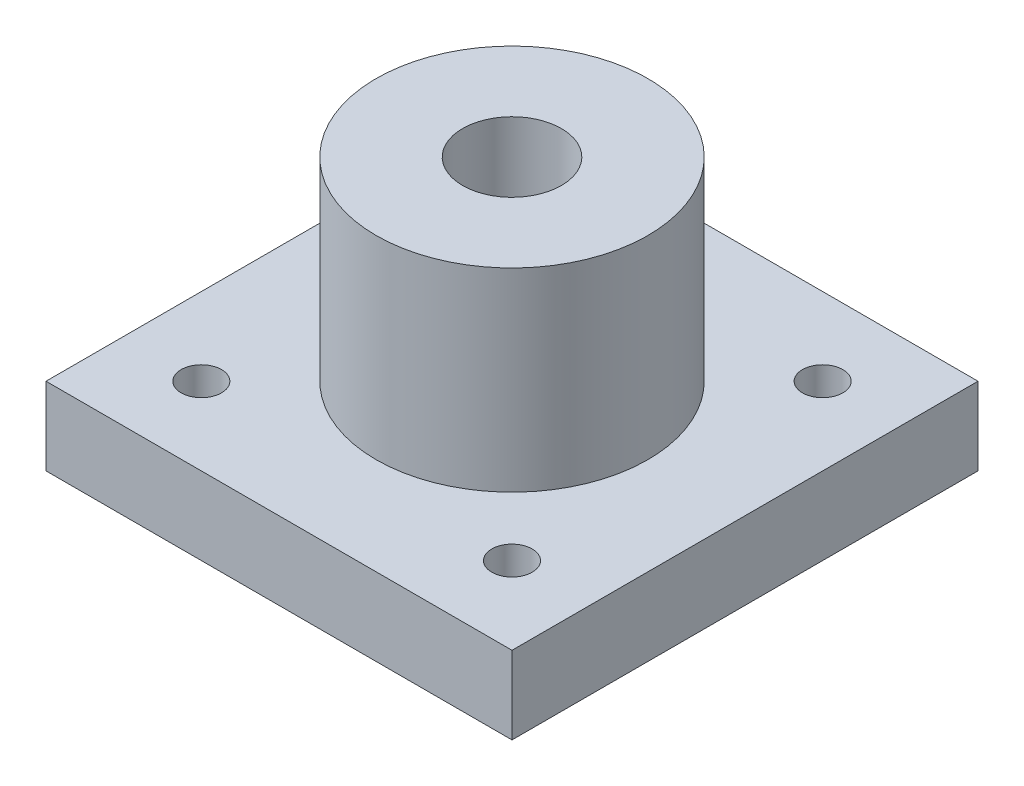
ISO-10303-21;
HEADER;
FILE_DESCRIPTION(('STEP AP214'),'2;1');
FILE_NAME('part.step','',(''),(''),'','','');
FILE_SCHEMA(('AUTOMOTIVE_DESIGN { 1 0 10303 214 1 1 1 1 }'));
ENDSEC;
DATA;
#1=APPLICATION_CONTEXT('core data for automotive mechanical design processes');
#2=APPLICATION_PROTOCOL_DEFINITION('international standard','automotive_design',2000,#1);
#3=PRODUCT_CONTEXT('',#1,'mechanical');
#4=PRODUCT('Part','Part','',(#3));
#5=PRODUCT_RELATED_PRODUCT_CATEGORY('part','',(#4));
#6=PRODUCT_DEFINITION_FORMATION('','',#4);
#7=PRODUCT_DEFINITION_CONTEXT('part definition',#1,'design');
#8=PRODUCT_DEFINITION('design','',#6,#7);
#9=PRODUCT_DEFINITION_SHAPE('','',#8);
#10=(LENGTH_UNIT() NAMED_UNIT(*) SI_UNIT(.MILLI.,.METRE.));
#11=(NAMED_UNIT(*) PLANE_ANGLE_UNIT() SI_UNIT($,.RADIAN.));
#12=(NAMED_UNIT(*) SI_UNIT($,.STERADIAN.) SOLID_ANGLE_UNIT());
#13=UNCERTAINTY_MEASURE_WITH_UNIT(LENGTH_MEASURE(1.E-05),#10,'distance_accuracy_value','');
#14=(GEOMETRIC_REPRESENTATION_CONTEXT(3) GLOBAL_UNCERTAINTY_ASSIGNED_CONTEXT((#13)) GLOBAL_UNIT_ASSIGNED_CONTEXT((#10,
#11,#12)) REPRESENTATION_CONTEXT('',''));
#15=CARTESIAN_POINT('',(0.,0.,0.));
#16=DIRECTION('',(0.,0.,1.));
#17=DIRECTION('',(1.,0.,0.));
#18=AXIS2_PLACEMENT_3D('',#15,#16,#17);
#19=CARTESIAN_POINT('',(0.,10.,0.));
#20=DIRECTION('',(0.,-1.,0.));
#21=DIRECTION('',(0.,0.,-1.));
#22=AXIS2_PLACEMENT_3D('',#19,#20,#21);
#23=PLANE('',#22);
#24=CARTESIAN_POINT('',(0.,10.,0.));
#25=DIRECTION('',(0.,1.,0.));
#26=DIRECTION('',(0.,0.,1.));
#27=AXIS2_PLACEMENT_3D('',#24,#25,#26);
#28=CIRCLE('',#27,17.5);
#29=CARTESIAN_POINT('',(0.,10.,17.5));
#30=VERTEX_POINT('',#29);
#31=EDGE_CURVE('E11',#30,#30,#28,.T.);
#32=ORIENTED_EDGE('',*,*,#31,.F.);
#33=EDGE_LOOP('',(#32));
#34=FACE_BOUND('',#33,.T.);
#35=DIRECTION('',(0.,0.,-1.));
#36=VECTOR('',#35,1.);
#37=CARTESIAN_POINT('',(30.,10.,30.));
#38=LINE('',#37,#36);
#39=CARTESIAN_POINT('',(30.,10.,30.));
#40=VERTEX_POINT('',#39);
#41=CARTESIAN_POINT('',(30.,10.,-30.));
#42=VERTEX_POINT('',#41);
#43=EDGE_CURVE('E95',#40,#42,#38,.T.);
#44=ORIENTED_EDGE('',*,*,#43,.T.);
#45=DIRECTION('',(-1.,0.,0.));
#46=VECTOR('',#45,1.);
#47=CARTESIAN_POINT('',(-30.,10.,-30.));
#48=LINE('',#47,#46);
#49=CARTESIAN_POINT('',(-30.,10.,-30.));
#50=VERTEX_POINT('',#49);
#51=EDGE_CURVE('E87',#42,#50,#48,.T.);
#52=ORIENTED_EDGE('',*,*,#51,.T.);
#53=DIRECTION('',(0.,0.,1.));
#54=VECTOR('',#53,1.);
#55=CARTESIAN_POINT('',(-30.,10.,30.));
#56=LINE('',#55,#54);
#57=CARTESIAN_POINT('',(-30.,10.,30.));
#58=VERTEX_POINT('',#57);
#59=EDGE_CURVE('E89',#50,#58,#56,.T.);
#60=ORIENTED_EDGE('',*,*,#59,.T.);
#61=DIRECTION('',(1.,0.,0.));
#62=VECTOR('',#61,1.);
#63=CARTESIAN_POINT('',(-30.,10.,30.));
#64=LINE('',#63,#62);
#65=EDGE_CURVE('E57',#58,#40,#64,.T.);
#66=ORIENTED_EDGE('',*,*,#65,.T.);
#67=EDGE_LOOP('',(#44,#52,#60,#66));
#68=FACE_BOUND('',#67,.T.);
#69=CARTESIAN_POINT('',(-20.,10.,-20.));
#70=DIRECTION('',(0.,1.,0.));
#71=DIRECTION('',(0.,0.,1.));
#72=AXIS2_PLACEMENT_3D('',#69,#70,#71);
#73=CIRCLE('',#72,2.6);
#74=CARTESIAN_POINT('',(-20.,10.,-17.4));
#75=VERTEX_POINT('',#74);
#76=EDGE_CURVE('E107',#75,#75,#73,.T.);
#77=ORIENTED_EDGE('',*,*,#76,.F.);
#78=EDGE_LOOP('',(#77));
#79=FACE_BOUND('',#78,.T.);
#80=CARTESIAN_POINT('',(20.,10.,-20.));
#81=DIRECTION('',(0.,1.,0.));
#82=DIRECTION('',(0.,0.,1.));
#83=AXIS2_PLACEMENT_3D('',#80,#81,#82);
#84=CIRCLE('',#83,2.6);
#85=CARTESIAN_POINT('',(20.,10.,-17.4));
#86=VERTEX_POINT('',#85);
#87=EDGE_CURVE('E121',#86,#86,#84,.T.);
#88=ORIENTED_EDGE('',*,*,#87,.F.);
#89=EDGE_LOOP('',(#88));
#90=FACE_BOUND('',#89,.T.);
#91=CARTESIAN_POINT('',(-20.,10.,20.));
#92=DIRECTION('',(0.,1.,0.));
#93=DIRECTION('',(0.,0.,1.));
#94=AXIS2_PLACEMENT_3D('',#91,#92,#93);
#95=CIRCLE('',#94,2.6);
#96=CARTESIAN_POINT('',(-20.,10.,22.6));
#97=VERTEX_POINT('',#96);
#98=EDGE_CURVE('E129',#97,#97,#95,.T.);
#99=ORIENTED_EDGE('',*,*,#98,.F.);
#100=EDGE_LOOP('',(#99));
#101=FACE_BOUND('',#100,.T.);
#102=CARTESIAN_POINT('',(20.,10.,20.));
#103=DIRECTION('',(0.,1.,0.));
#104=DIRECTION('',(0.,0.,1.));
#105=AXIS2_PLACEMENT_3D('',#102,#103,#104);
#106=CIRCLE('',#105,2.6);
#107=CARTESIAN_POINT('',(20.,10.,22.6));
#108=VERTEX_POINT('',#107);
#109=EDGE_CURVE('E132',#108,#108,#106,.T.);
#110=ORIENTED_EDGE('',*,*,#109,.F.);
#111=EDGE_LOOP('',(#110));
#112=FACE_BOUND('',#111,.T.);
#113=ADVANCED_FACE('F36',(#34,#68,#79,#90,#101,#112),#23,.F.);
#114=CARTESIAN_POINT('',(0.,0.,0.));
#115=DIRECTION('',(0.,-1.,0.));
#116=DIRECTION('',(0.,0.,-1.));
#117=AXIS2_PLACEMENT_3D('',#114,#115,#116);
#118=PLANE('',#117);
#119=CARTESIAN_POINT('',(-20.,0.,20.));
#120=DIRECTION('',(0.,1.,0.));
#121=DIRECTION('',(0.,0.,1.));
#122=AXIS2_PLACEMENT_3D('',#119,#120,#121);
#123=CIRCLE('',#122,2.6);
#124=CARTESIAN_POINT('',(-20.,0.,22.6));
#125=VERTEX_POINT('',#124);
#126=EDGE_CURVE('E131',#125,#125,#123,.T.);
#127=ORIENTED_EDGE('',*,*,#126,.T.);
#128=EDGE_LOOP('',(#127));
#129=FACE_BOUND('',#128,.T.);
#130=CARTESIAN_POINT('',(-20.,0.,-20.));
#131=DIRECTION('',(0.,1.,0.));
#132=DIRECTION('',(0.,0.,1.));
#133=AXIS2_PLACEMENT_3D('',#130,#131,#132);
#134=CIRCLE('',#133,2.6);
#135=CARTESIAN_POINT('',(-20.,0.,-17.4));
#136=VERTEX_POINT('',#135);
#137=EDGE_CURVE('E117',#136,#136,#134,.T.);
#138=ORIENTED_EDGE('',*,*,#137,.T.);
#139=EDGE_LOOP('',(#138));
#140=FACE_BOUND('',#139,.T.);
#141=DIRECTION('',(0.,0.,-1.));
#142=VECTOR('',#141,1.);
#143=CARTESIAN_POINT('',(30.,0.,30.));
#144=LINE('',#143,#142);
#145=CARTESIAN_POINT('',(30.,0.,30.));
#146=VERTEX_POINT('',#145);
#147=CARTESIAN_POINT('',(30.,0.,-30.));
#148=VERTEX_POINT('',#147);
#149=EDGE_CURVE('E104',#146,#148,#144,.T.);
#150=ORIENTED_EDGE('',*,*,#149,.F.);
#151=DIRECTION('',(1.,0.,0.));
#152=VECTOR('',#151,1.);
#153=CARTESIAN_POINT('',(-30.,0.,30.));
#154=LINE('',#153,#152);
#155=CARTESIAN_POINT('',(-30.,0.,30.));
#156=VERTEX_POINT('',#155);
#157=EDGE_CURVE('E78',#156,#146,#154,.T.);
#158=ORIENTED_EDGE('',*,*,#157,.F.);
#159=DIRECTION('',(0.,0.,1.));
#160=VECTOR('',#159,1.);
#161=CARTESIAN_POINT('',(-30.,0.,30.));
#162=LINE('',#161,#160);
#163=CARTESIAN_POINT('',(-30.,0.,-30.));
#164=VERTEX_POINT('',#163);
#165=EDGE_CURVE('E71',#164,#156,#162,.T.);
#166=ORIENTED_EDGE('',*,*,#165,.F.);
#167=DIRECTION('',(-1.,0.,0.));
#168=VECTOR('',#167,1.);
#169=CARTESIAN_POINT('',(-30.,0.,-30.));
#170=LINE('',#169,#168);
#171=EDGE_CURVE('E100',#148,#164,#170,.T.);
#172=ORIENTED_EDGE('',*,*,#171,.F.);
#173=EDGE_LOOP('',(#150,#158,#166,#172));
#174=FACE_BOUND('',#173,.T.);
#175=CARTESIAN_POINT('',(20.,0.,-20.));
#176=DIRECTION('',(0.,1.,0.));
#177=DIRECTION('',(0.,0.,1.));
#178=AXIS2_PLACEMENT_3D('',#175,#176,#177);
#179=CIRCLE('',#178,2.6);
#180=CARTESIAN_POINT('',(20.,0.,-17.4));
#181=VERTEX_POINT('',#180);
#182=EDGE_CURVE('E127',#181,#181,#179,.T.);
#183=ORIENTED_EDGE('',*,*,#182,.T.);
#184=EDGE_LOOP('',(#183));
#185=FACE_BOUND('',#184,.T.);
#186=CARTESIAN_POINT('',(20.,0.,20.));
#187=DIRECTION('',(0.,1.,0.));
#188=DIRECTION('',(0.,0.,1.));
#189=AXIS2_PLACEMENT_3D('',#186,#187,#188);
#190=CIRCLE('',#189,2.6);
#191=CARTESIAN_POINT('',(20.,0.,22.6));
#192=VERTEX_POINT('',#191);
#193=EDGE_CURVE('E136',#192,#192,#190,.T.);
#194=ORIENTED_EDGE('',*,*,#193,.T.);
#195=EDGE_LOOP('',(#194));
#196=FACE_BOUND('',#195,.T.);
#197=ADVANCED_FACE('F119',(#129,#140,#174,#185,#196),#118,.T.);
#198=CARTESIAN_POINT('',(30.,10.,30.));
#199=DIRECTION('',(-1.,0.,0.));
#200=DIRECTION('',(0.,0.,1.));
#201=AXIS2_PLACEMENT_3D('',#198,#199,#200);
#202=PLANE('',#201);
#203=ORIENTED_EDGE('',*,*,#149,.T.);
#204=DIRECTION('',(0.,-1.,0.));
#205=VECTOR('',#204,1.);
#206=CARTESIAN_POINT('',(30.,10.,-30.));
#207=LINE('',#206,#205);
#208=EDGE_CURVE('E45',#42,#148,#207,.T.);
#209=ORIENTED_EDGE('',*,*,#208,.F.);
#210=ORIENTED_EDGE('',*,*,#43,.F.);
#211=DIRECTION('',(0.,-1.,0.));
#212=VECTOR('',#211,1.);
#213=CARTESIAN_POINT('',(30.,10.,30.));
#214=LINE('',#213,#212);
#215=EDGE_CURVE('E101',#40,#146,#214,.T.);
#216=ORIENTED_EDGE('',*,*,#215,.T.);
#217=EDGE_LOOP('',(#203,#209,#210,#216));
#218=FACE_BOUND('',#217,.T.);
#219=ADVANCED_FACE('F37',(#218),#202,.F.);
#220=CARTESIAN_POINT('',(-30.,10.,-30.));
#221=DIRECTION('',(0.,0.,1.));
#222=DIRECTION('',(1.,0.,0.));
#223=AXIS2_PLACEMENT_3D('',#220,#221,#222);
#224=PLANE('',#223);
#225=ORIENTED_EDGE('',*,*,#171,.T.);
#226=DIRECTION('',(0.,-1.,0.));
#227=VECTOR('',#226,1.);
#228=CARTESIAN_POINT('',(-30.,10.,-30.));
#229=LINE('',#228,#227);
#230=EDGE_CURVE('E92',#50,#164,#229,.T.);
#231=ORIENTED_EDGE('',*,*,#230,.F.);
#232=ORIENTED_EDGE('',*,*,#51,.F.);
#233=ORIENTED_EDGE('',*,*,#208,.T.);
#234=EDGE_LOOP('',(#225,#231,#232,#233));
#235=FACE_BOUND('',#234,.T.);
#236=ADVANCED_FACE('F96',(#235),#224,.F.);
#237=CARTESIAN_POINT('',(-30.,10.,30.));
#238=DIRECTION('',(1.,0.,0.));
#239=DIRECTION('',(0.,0.,-1.));
#240=AXIS2_PLACEMENT_3D('',#237,#238,#239);
#241=PLANE('',#240);
#242=ORIENTED_EDGE('',*,*,#165,.T.);
#243=DIRECTION('',(0.,-1.,0.));
#244=VECTOR('',#243,1.);
#245=CARTESIAN_POINT('',(-30.,10.,30.));
#246=LINE('',#245,#244);
#247=EDGE_CURVE('E98',#58,#156,#246,.T.);
#248=ORIENTED_EDGE('',*,*,#247,.F.);
#249=ORIENTED_EDGE('',*,*,#59,.F.);
#250=ORIENTED_EDGE('',*,*,#230,.T.);
#251=EDGE_LOOP('',(#242,#248,#249,#250));
#252=FACE_BOUND('',#251,.T.);
#253=ADVANCED_FACE('F97',(#252),#241,.F.);
#254=CARTESIAN_POINT('',(-30.,10.,30.));
#255=DIRECTION('',(0.,0.,-1.));
#256=DIRECTION('',(-1.,0.,0.));
#257=AXIS2_PLACEMENT_3D('',#254,#255,#256);
#258=PLANE('',#257);
#259=ORIENTED_EDGE('',*,*,#157,.T.);
#260=ORIENTED_EDGE('',*,*,#215,.F.);
#261=ORIENTED_EDGE('',*,*,#65,.F.);
#262=ORIENTED_EDGE('',*,*,#247,.T.);
#263=EDGE_LOOP('',(#259,#260,#261,#262));
#264=FACE_BOUND('',#263,.T.);
#265=ADVANCED_FACE('F114',(#264),#258,.F.);
#266=CARTESIAN_POINT('',(-20.,10.,-20.));
#267=DIRECTION('',(0.,-1.,0.));
#268=DIRECTION('',(0.,0.,-1.));
#269=AXIS2_PLACEMENT_3D('',#266,#267,#268);
#270=CYLINDRICAL_SURFACE('',#269,2.6);
#271=ORIENTED_EDGE('',*,*,#76,.T.);
#272=EDGE_LOOP('',(#271));
#273=FACE_BOUND('',#272,.T.);
#274=ORIENTED_EDGE('',*,*,#137,.F.);
#275=EDGE_LOOP('',(#274));
#276=FACE_BOUND('',#275,.T.);
#277=ADVANCED_FACE('F227',(#273,#276),#270,.F.);
#278=CARTESIAN_POINT('',(20.,10.,-20.));
#279=DIRECTION('',(0.,-1.,0.));
#280=DIRECTION('',(0.,0.,-1.));
#281=AXIS2_PLACEMENT_3D('',#278,#279,#280);
#282=CYLINDRICAL_SURFACE('',#281,2.6);
#283=ORIENTED_EDGE('',*,*,#87,.T.);
#284=EDGE_LOOP('',(#283));
#285=FACE_BOUND('',#284,.T.);
#286=ORIENTED_EDGE('',*,*,#182,.F.);
#287=EDGE_LOOP('',(#286));
#288=FACE_BOUND('',#287,.T.);
#289=ADVANCED_FACE('F219',(#285,#288),#282,.F.);
#290=CARTESIAN_POINT('',(-20.,10.,20.));
#291=DIRECTION('',(0.,-1.,0.));
#292=DIRECTION('',(0.,0.,-1.));
#293=AXIS2_PLACEMENT_3D('',#290,#291,#292);
#294=CYLINDRICAL_SURFACE('',#293,2.6);
#295=ORIENTED_EDGE('',*,*,#98,.T.);
#296=EDGE_LOOP('',(#295));
#297=FACE_BOUND('',#296,.T.);
#298=ORIENTED_EDGE('',*,*,#126,.F.);
#299=EDGE_LOOP('',(#298));
#300=FACE_BOUND('',#299,.T.);
#301=ADVANCED_FACE('F166',(#297,#300),#294,.F.);
#302=CARTESIAN_POINT('',(20.,10.,20.));
#303=DIRECTION('',(0.,-1.,0.));
#304=DIRECTION('',(0.,0.,-1.));
#305=AXIS2_PLACEMENT_3D('',#302,#303,#304);
#306=CYLINDRICAL_SURFACE('',#305,2.6);
#307=ORIENTED_EDGE('',*,*,#109,.T.);
#308=EDGE_LOOP('',(#307));
#309=FACE_BOUND('',#308,.T.);
#310=ORIENTED_EDGE('',*,*,#193,.F.);
#311=EDGE_LOOP('',(#310));
#312=FACE_BOUND('',#311,.T.);
#313=ADVANCED_FACE('F157',(#309,#312),#306,.F.);
#314=CARTESIAN_POINT('',(0.,35.,0.));
#315=DIRECTION('',(0.,1.,0.));
#316=DIRECTION('',(0.,0.,1.));
#317=AXIS2_PLACEMENT_3D('',#314,#315,#316);
#318=PLANE('',#317);
#319=CARTESIAN_POINT('',(0.,35.,0.));
#320=DIRECTION('',(0.,1.,0.));
#321=DIRECTION('',(0.,0.,1.));
#322=AXIS2_PLACEMENT_3D('',#319,#320,#321);
#323=CIRCLE('',#322,17.5);
#324=CARTESIAN_POINT('',(0.,35.,17.5));
#325=VERTEX_POINT('',#324);
#326=EDGE_CURVE('E143',#325,#325,#323,.T.);
#327=ORIENTED_EDGE('',*,*,#326,.T.);
#328=EDGE_LOOP('',(#327));
#329=FACE_BOUND('',#328,.T.);
#330=CARTESIAN_POINT('',(0.,35.,0.));
#331=DIRECTION('',(0.,1.,0.));
#332=DIRECTION('',(0.,0.,1.));
#333=AXIS2_PLACEMENT_3D('',#330,#331,#332);
#334=CIRCLE('',#333,6.35889);
#335=CARTESIAN_POINT('',(0.,35.,6.35889));
#336=VERTEX_POINT('',#335);
#337=EDGE_CURVE('E148',#336,#336,#334,.T.);
#338=ORIENTED_EDGE('',*,*,#337,.F.);
#339=EDGE_LOOP('',(#338));
#340=FACE_BOUND('',#339,.T.);
#341=ADVANCED_FACE('F156',(#329,#340),#318,.T.);
#342=CARTESIAN_POINT('',(0.,35.,0.));
#343=DIRECTION('',(0.,-1.,0.));
#344=DIRECTION('',(0.,0.,-1.));
#345=AXIS2_PLACEMENT_3D('',#342,#343,#344);
#346=CYLINDRICAL_SURFACE('',#345,17.5);
#347=ORIENTED_EDGE('',*,*,#326,.F.);
#348=EDGE_LOOP('',(#347));
#349=FACE_BOUND('',#348,.T.);
#350=ORIENTED_EDGE('',*,*,#31,.T.);
#351=EDGE_LOOP('',(#350));
#352=FACE_BOUND('',#351,.T.);
#353=ADVANCED_FACE('F158',(#349,#352),#346,.T.);
#354=CARTESIAN_POINT('',(0.,35.,0.));
#355=DIRECTION('',(0.,-1.,0.));
#356=DIRECTION('',(0.,0.,-1.));
#357=AXIS2_PLACEMENT_3D('',#354,#355,#356);
#358=CYLINDRICAL_SURFACE('',#357,6.35889);
#359=ORIENTED_EDGE('',*,*,#337,.T.);
#360=EDGE_LOOP('',(#359));
#361=FACE_BOUND('',#360,.T.);
#362=CARTESIAN_POINT('',(0.,10.,0.));
#363=DIRECTION('',(0.,1.,0.));
#364=DIRECTION('',(0.,0.,1.));
#365=AXIS2_PLACEMENT_3D('',#362,#363,#364);
#366=CIRCLE('',#365,6.35889);
#367=CARTESIAN_POINT('',(0.,10.,6.35889));
#368=VERTEX_POINT('',#367);
#369=EDGE_CURVE('E150',#368,#368,#366,.T.);
#370=ORIENTED_EDGE('',*,*,#369,.F.);
#371=EDGE_LOOP('',(#370));
#372=FACE_BOUND('',#371,.T.);
#373=ADVANCED_FACE('F153',(#361,#372),#358,.F.);
#374=ORIENTED_EDGE('',*,*,#369,.T.);
#375=EDGE_LOOP('',(#374));
#376=FACE_BOUND('',#375,.T.);
#377=ADVANCED_FACE('F172',(#376),#23,.F.);
#378=CLOSED_SHELL('',(#113,#197,#219,#236,#253,#265,#277,#289,#301,#313,#341,#353,#373,#377));
#379=MANIFOLD_SOLID_BREP('B2',#378);
#380=ADVANCED_BREP_SHAPE_REPRESENTATION('',(#18,#379),#14);
#381=SHAPE_DEFINITION_REPRESENTATION(#9,#380);
ENDSEC;
END-ISO-10303-21;
